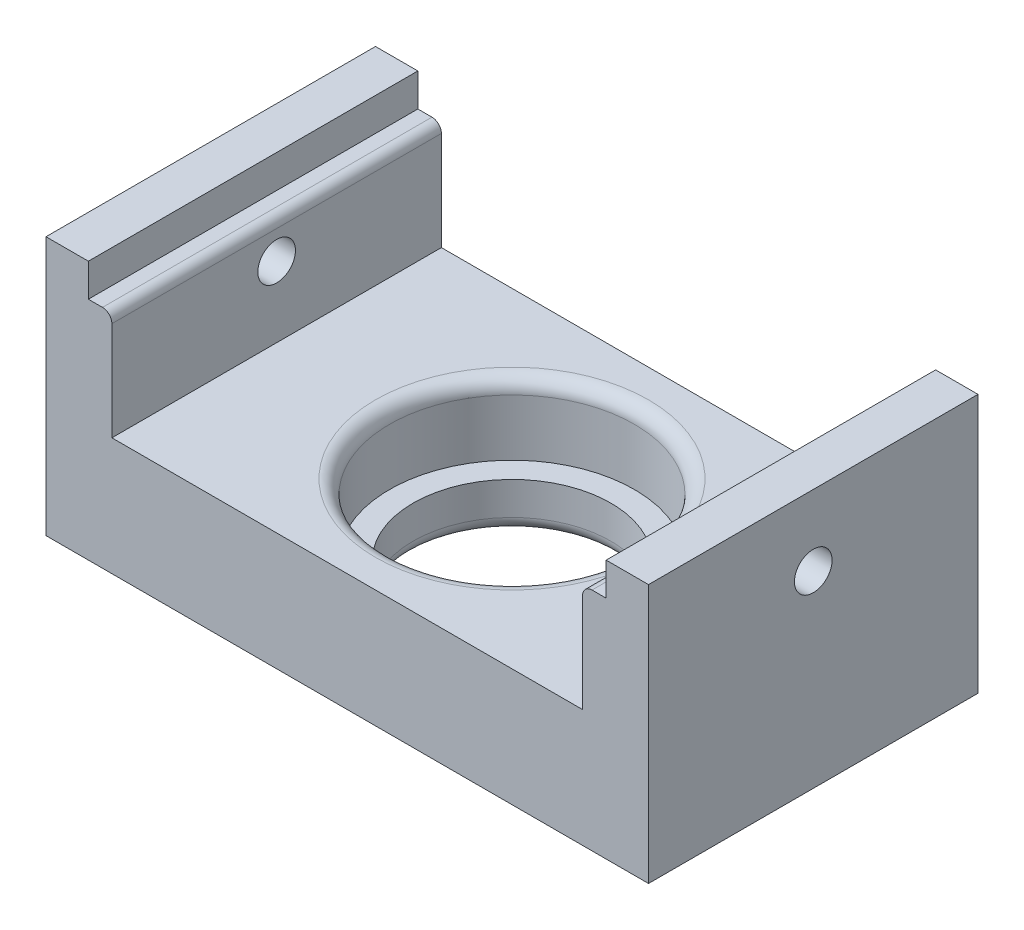
ISO-10303-21;
HEADER;
FILE_DESCRIPTION(('STEP AP214'),'2;1');
FILE_NAME('part.step','',(''),(''),'','','');
FILE_SCHEMA(('AUTOMOTIVE_DESIGN { 1 0 10303 214 1 1 1 1 }'));
ENDSEC;
DATA;
#1=APPLICATION_CONTEXT('core data for automotive mechanical design processes');
#2=APPLICATION_PROTOCOL_DEFINITION('international standard','automotive_design',2000,#1);
#3=PRODUCT_CONTEXT('',#1,'mechanical');
#4=PRODUCT('Part','Part','',(#3));
#5=PRODUCT_RELATED_PRODUCT_CATEGORY('part','',(#4));
#6=PRODUCT_DEFINITION_FORMATION('','',#4);
#7=PRODUCT_DEFINITION_CONTEXT('part definition',#1,'design');
#8=PRODUCT_DEFINITION('design','',#6,#7);
#9=PRODUCT_DEFINITION_SHAPE('','',#8);
#10=(LENGTH_UNIT() NAMED_UNIT(*) SI_UNIT(.MILLI.,.METRE.));
#11=(NAMED_UNIT(*) PLANE_ANGLE_UNIT() SI_UNIT($,.RADIAN.));
#12=(NAMED_UNIT(*) SI_UNIT($,.STERADIAN.) SOLID_ANGLE_UNIT());
#13=UNCERTAINTY_MEASURE_WITH_UNIT(LENGTH_MEASURE(1.E-05),#10,'distance_accuracy_value','');
#14=(GEOMETRIC_REPRESENTATION_CONTEXT(3) GLOBAL_UNCERTAINTY_ASSIGNED_CONTEXT((#13)) GLOBAL_UNIT_ASSIGNED_CONTEXT((#10,
#11,#12)) REPRESENTATION_CONTEXT('',''));
#15=CARTESIAN_POINT('',(0.,0.,0.));
#16=DIRECTION('',(0.,0.,1.));
#17=DIRECTION('',(1.,0.,0.));
#18=AXIS2_PLACEMENT_3D('',#15,#16,#17);
#19=CARTESIAN_POINT('',(25.,13.7500000000225,-3.7499999999823));
#20=DIRECTION('',(1.,0.,0.));
#21=DIRECTION('',(0.,1.28703991908452E-12,-1.));
#22=AXIS2_PLACEMENT_3D('',#19,#20,#21);
#23=PLANE('',#22);
#24=CARTESIAN_POINT('',(25.,6.24999999999997,13.750000000008));
#25=DIRECTION('',(-1.,0.,0.));
#26=DIRECTION('',(0.,-1.28703991908452E-12,1.));
#27=AXIS2_PLACEMENT_3D('',#24,#25,#26);
#28=CIRCLE('',#27,2.);
#29=CARTESIAN_POINT('',(25.,6.2499999999974,15.750000000008));
#30=VERTEX_POINT('',#29);
#31=EDGE_CURVE('E200',#30,#30,#28,.T.);
#32=ORIENTED_EDGE('',*,*,#31,.F.);
#33=EDGE_LOOP('',(#32));
#34=FACE_BOUND('',#33,.T.);
#35=DIRECTION('',(0.,-1.,-1.28703991908452E-12));
#36=VECTOR('',#35,1.);
#37=CARTESIAN_POINT('',(25.,13.7499999999775,31.2500000000177));
#38=LINE('',#37,#36);
#39=CARTESIAN_POINT('',(25.,9.24999999997745,31.2500000000119));
#40=VERTEX_POINT('',#39);
#41=CARTESIAN_POINT('',(25.,-1.25000000002255,31.2499999999984));
#42=VERTEX_POINT('',#41);
#43=EDGE_CURVE('E214',#40,#42,#38,.T.);
#44=ORIENTED_EDGE('',*,*,#43,.F.);
#45=DIRECTION('',(0.,-1.28703991908452E-12,1.));
#46=VECTOR('',#45,1.);
#47=CARTESIAN_POINT('',(25.,9.2500000000225,-3.74999999998809));
#48=LINE('',#47,#46);
#49=CARTESIAN_POINT('',(25.,9.2500000000225,-3.74999999998809));
#50=VERTEX_POINT('',#49);
#51=EDGE_CURVE('E322',#40,#50,#48,.F.);
#52=ORIENTED_EDGE('',*,*,#51,.T.);
#53=DIRECTION('',(0.,-1.,-1.28703991908452E-12));
#54=VECTOR('',#53,1.);
#55=CARTESIAN_POINT('',(25.,13.7500000000225,-3.7499999999823));
#56=LINE('',#55,#54);
#57=CARTESIAN_POINT('',(25.,-1.2499999999775,-3.75000000000161));
#58=VERTEX_POINT('',#57);
#59=EDGE_CURVE('E208',#50,#58,#56,.T.);
#60=ORIENTED_EDGE('',*,*,#59,.T.);
#61=DIRECTION('',(0.,-1.28703991908452E-12,1.));
#62=VECTOR('',#61,1.);
#63=CARTESIAN_POINT('',(25.,-1.2499999999775,-3.75000000000161));
#64=LINE('',#63,#62);
#65=EDGE_CURVE('E218',#58,#42,#64,.T.);
#66=ORIENTED_EDGE('',*,*,#65,.T.);
#67=EDGE_LOOP('',(#44,#52,#60,#66));
#68=FACE_BOUND('',#67,.T.);
#69=ADVANCED_FACE('F42',(#34,#68),#23,.F.);
#70=CARTESIAN_POINT('',(0.,-1.25000000000003,13.7499999999984));
#71=DIRECTION('',(0.,1.,1.28703991908452E-12));
#72=DIRECTION('',(1.,0.,0.));
#73=AXIS2_PLACEMENT_3D('',#70,#71,#72);
#74=PLANE('',#73);
#75=CARTESIAN_POINT('',(0.,-1.25000000000003,13.7499999999984));
#76=DIRECTION('',(0.,1.,1.28703991908452E-12));
#77=DIRECTION('',(1.,0.,0.));
#78=AXIS2_PLACEMENT_3D('',#75,#76,#77);
#79=CIRCLE('',#78,14.5);
#80=CARTESIAN_POINT('',(14.5,-1.25000000000003,13.7499999999984));
#81=VERTEX_POINT('',#80);
#82=EDGE_CURVE('E300',#81,#81,#79,.F.);
#83=ORIENTED_EDGE('',*,*,#82,.T.);
#84=EDGE_LOOP('',(#83));
#85=FACE_BOUND('',#84,.T.);
#86=DIRECTION('',(1.,0.,0.));
#87=VECTOR('',#86,1.);
#88=CARTESIAN_POINT('',(0.,-1.25000000002255,31.2499999999984));
#89=LINE('',#88,#87);
#90=CARTESIAN_POINT('',(-25.,-1.25000000002255,31.2499999999984));
#91=VERTEX_POINT('',#90);
#92=EDGE_CURVE('E261',#91,#42,#89,.T.);
#93=ORIENTED_EDGE('',*,*,#92,.T.);
#94=ORIENTED_EDGE('',*,*,#65,.F.);
#95=DIRECTION('',(1.,0.,0.));
#96=VECTOR('',#95,1.);
#97=CARTESIAN_POINT('',(0.,-1.2499999999775,-3.75000000000161));
#98=LINE('',#97,#96);
#99=CARTESIAN_POINT('',(-25.,-1.2499999999775,-3.75000000000161));
#100=VERTEX_POINT('',#99);
#101=EDGE_CURVE('E257',#100,#58,#98,.T.);
#102=ORIENTED_EDGE('',*,*,#101,.F.);
#103=DIRECTION('',(0.,1.28703991908452E-12,-1.));
#104=VECTOR('',#103,1.);
#105=CARTESIAN_POINT('',(-25.,-1.2499999999775,-3.75000000000161));
#106=LINE('',#105,#104);
#107=EDGE_CURVE('E222',#91,#100,#106,.T.);
#108=ORIENTED_EDGE('',*,*,#107,.F.);
#109=EDGE_LOOP('',(#93,#94,#102,#108));
#110=FACE_BOUND('',#109,.T.);
#111=ADVANCED_FACE('F349',(#85,#110),#74,.T.);
#112=CARTESIAN_POINT('',(0.,-1.25000000000003,13.7499999999984));
#113=DIRECTION('',(0.,-1.,-1.28703991908452E-12));
#114=DIRECTION('',(-1.,0.,0.));
#115=AXIS2_PLACEMENT_3D('',#112,#113,#114);
#116=CYLINDRICAL_SURFACE('',#115,10.5);
#117=CARTESIAN_POINT('',(0.,-12.25,13.7499999999842));
#118=DIRECTION('',(0.,1.,1.28703991908452E-12));
#119=DIRECTION('',(1.,0.,0.));
#120=AXIS2_PLACEMENT_3D('',#117,#118,#119);
#121=CIRCLE('',#120,10.5);
#122=CARTESIAN_POINT('',(10.5,-12.25,13.7499999999842));
#123=VERTEX_POINT('',#122);
#124=EDGE_CURVE('E308',#123,#123,#121,.F.);
#125=ORIENTED_EDGE('',*,*,#124,.T.);
#126=EDGE_LOOP('',(#125));
#127=FACE_BOUND('',#126,.T.);
#128=CARTESIAN_POINT('',(0.,-8.75000000000002,13.7499999999887));
#129=DIRECTION('',(0.,1.,1.28703991908452E-12));
#130=DIRECTION('',(1.,0.,0.));
#131=AXIS2_PLACEMENT_3D('',#128,#129,#130);
#132=CIRCLE('',#131,10.5);
#133=CARTESIAN_POINT('',(10.5,-8.75000000000002,13.7499999999887));
#134=VERTEX_POINT('',#133);
#135=EDGE_CURVE('E256',#134,#134,#132,.T.);
#136=ORIENTED_EDGE('',*,*,#135,.T.);
#137=EDGE_LOOP('',(#136));
#138=FACE_BOUND('',#137,.T.);
#139=ADVANCED_FACE('F396',(#127,#138),#116,.F.);
#140=CARTESIAN_POINT('',(32.,-1.25000000000003,13.7499999999984));
#141=DIRECTION('',(1.,0.,0.));
#142=DIRECTION('',(0.,-1.,-1.28703991908452E-12));
#143=AXIS2_PLACEMENT_3D('',#140,#141,#142);
#144=PLANE('',#143);
#145=CARTESIAN_POINT('',(32.,6.24999999999997,13.750000000008));
#146=DIRECTION('',(-1.,0.,0.));
#147=DIRECTION('',(0.,-1.28703991908452E-12,1.));
#148=AXIS2_PLACEMENT_3D('',#145,#146,#147);
#149=CIRCLE('',#148,2.);
#150=CARTESIAN_POINT('',(32.,6.2499999999974,15.750000000008));
#151=VERTEX_POINT('',#150);
#152=EDGE_CURVE('E204',#151,#151,#149,.T.);
#153=ORIENTED_EDGE('',*,*,#152,.T.);
#154=EDGE_LOOP('',(#153));
#155=FACE_BOUND('',#154,.T.);
#156=DIRECTION('',(0.,-1.28703991908452E-12,1.));
#157=VECTOR('',#156,1.);
#158=CARTESIAN_POINT('',(32.,-13.75,13.7499999999823));
#159=LINE('',#158,#157);
#160=CARTESIAN_POINT('',(32.,-13.7499999999775,-3.75000000001769));
#161=VERTEX_POINT('',#160);
#162=CARTESIAN_POINT('',(32.,-13.7500000000225,31.2499999999823));
#163=VERTEX_POINT('',#162);
#164=EDGE_CURVE('E267',#161,#163,#159,.T.);
#165=ORIENTED_EDGE('',*,*,#164,.F.);
#166=DIRECTION('',(0.,-1.,-1.28703991908452E-12));
#167=VECTOR('',#166,1.);
#168=CARTESIAN_POINT('',(32.,-1.2499999999775,-3.75000000000161));
#169=LINE('',#168,#167);
#170=CARTESIAN_POINT('',(32.,13.7500000000225,-3.7499999999823));
#171=VERTEX_POINT('',#170);
#172=EDGE_CURVE('E290',#171,#161,#169,.T.);
#173=ORIENTED_EDGE('',*,*,#172,.F.);
#174=DIRECTION('',(0.,1.28703991908452E-12,-1.));
#175=VECTOR('',#174,1.);
#176=CARTESIAN_POINT('',(32.,13.7500000000225,-3.7499999999823));
#177=LINE('',#176,#175);
#178=CARTESIAN_POINT('',(32.,13.7499999999775,31.2500000000177));
#179=VERTEX_POINT('',#178);
#180=EDGE_CURVE('E223',#179,#171,#177,.T.);
#181=ORIENTED_EDGE('',*,*,#180,.F.);
#182=DIRECTION('',(0.,-1.,-1.28703991908452E-12));
#183=VECTOR('',#182,1.);
#184=CARTESIAN_POINT('',(32.,-1.25000000002255,31.2499999999984));
#185=LINE('',#184,#183);
#186=EDGE_CURVE('E266',#179,#163,#185,.T.);
#187=ORIENTED_EDGE('',*,*,#186,.T.);
#188=EDGE_LOOP('',(#165,#173,#181,#187));
#189=FACE_BOUND('',#188,.T.);
#190=ADVANCED_FACE('F369',(#155,#189),#144,.T.);
#191=CARTESIAN_POINT('',(0.,-1.2499999999775,-3.75000000000161));
#192=DIRECTION('',(0.,1.28703991908452E-12,-1.));
#193=DIRECTION('',(0.,1.,1.28703991908452E-12));
#194=AXIS2_PLACEMENT_3D('',#191,#192,#193);
#195=PLANE('',#194);
#196=ORIENTED_EDGE('',*,*,#59,.F.);
#197=CARTESIAN_POINT('',(26.,9.2500000000225,-3.74999999998809));
#198=DIRECTION('',(0.,1.28703991908452E-12,-1.));
#199=DIRECTION('',(0.,1.,1.28703991908452E-12));
#200=AXIS2_PLACEMENT_3D('',#197,#198,#199);
#201=CIRCLE('',#200,1.);
#202=CARTESIAN_POINT('',(26.,10.2500000000225,-3.74999999998681));
#203=VERTEX_POINT('',#202);
#204=EDGE_CURVE('E327',#50,#203,#201,.T.);
#205=ORIENTED_EDGE('',*,*,#204,.T.);
#206=DIRECTION('',(-1.,0.,0.));
#207=VECTOR('',#206,1.);
#208=CARTESIAN_POINT('',(25.,10.2500000000225,-3.74999999998681));
#209=LINE('',#208,#207);
#210=CARTESIAN_POINT('',(27.5,10.2500000000225,-3.74999999998681));
#211=VERTEX_POINT('',#210);
#212=EDGE_CURVE('E178',#211,#203,#209,.T.);
#213=ORIENTED_EDGE('',*,*,#212,.F.);
#214=DIRECTION('',(0.,1.,1.28703991908452E-12));
#215=VECTOR('',#214,1.);
#216=CARTESIAN_POINT('',(27.5,10.2500000000225,-3.74999999998681));
#217=LINE('',#216,#215);
#218=CARTESIAN_POINT('',(27.5,13.7500000000225,-3.7499999999823));
#219=VERTEX_POINT('',#218);
#220=EDGE_CURVE('E179',#211,#219,#217,.T.);
#221=ORIENTED_EDGE('',*,*,#220,.T.);
#222=DIRECTION('',(-1.,0.,0.));
#223=VECTOR('',#222,1.);
#224=CARTESIAN_POINT('',(32.,13.7500000000225,-3.7499999999823));
#225=LINE('',#224,#223);
#226=EDGE_CURVE('E226',#171,#219,#225,.T.);
#227=ORIENTED_EDGE('',*,*,#226,.F.);
#228=ORIENTED_EDGE('',*,*,#172,.T.);
#229=DIRECTION('',(1.,0.,0.));
#230=VECTOR('',#229,1.);
#231=CARTESIAN_POINT('',(0.,-13.7499999999775,-3.75000000001769));
#232=LINE('',#231,#230);
#233=CARTESIAN_POINT('',(-32.,-13.7499999999775,-3.75000000001769));
#234=VERTEX_POINT('',#233);
#235=EDGE_CURVE('E271',#234,#161,#232,.T.);
#236=ORIENTED_EDGE('',*,*,#235,.F.);
#237=DIRECTION('',(0.,-1.,-1.28703991908452E-12));
#238=VECTOR('',#237,1.);
#239=CARTESIAN_POINT('',(-32.,-1.2499999999775,-3.75000000000161));
#240=LINE('',#239,#238);
#241=CARTESIAN_POINT('',(-32.,13.7500000000225,-3.7499999999823));
#242=VERTEX_POINT('',#241);
#243=EDGE_CURVE('E287',#242,#234,#240,.T.);
#244=ORIENTED_EDGE('',*,*,#243,.F.);
#245=DIRECTION('',(-1.,0.,0.));
#246=VECTOR('',#245,1.);
#247=CARTESIAN_POINT('',(-32.,13.7500000000225,-3.7499999999823));
#248=LINE('',#247,#246);
#249=CARTESIAN_POINT('',(-27.5,13.7500000000225,-3.7499999999823));
#250=VERTEX_POINT('',#249);
#251=EDGE_CURVE('E165',#250,#242,#248,.T.);
#252=ORIENTED_EDGE('',*,*,#251,.F.);
#253=DIRECTION('',(0.,1.,1.28703991908452E-12));
#254=VECTOR('',#253,1.);
#255=CARTESIAN_POINT('',(-27.5,10.2500000000225,-3.74999999998681));
#256=LINE('',#255,#254);
#257=CARTESIAN_POINT('',(-27.5,10.2500000000225,-3.74999999998681));
#258=VERTEX_POINT('',#257);
#259=EDGE_CURVE('E154',#258,#250,#256,.T.);
#260=ORIENTED_EDGE('',*,*,#259,.F.);
#261=DIRECTION('',(-1.,0.,0.));
#262=VECTOR('',#261,1.);
#263=CARTESIAN_POINT('',(-25.,10.2500000000225,-3.74999999998681));
#264=LINE('',#263,#262);
#265=CARTESIAN_POINT('',(-26.,10.2500000000225,-3.74999999998681));
#266=VERTEX_POINT('',#265);
#267=EDGE_CURVE('E142',#266,#258,#264,.T.);
#268=ORIENTED_EDGE('',*,*,#267,.F.);
#269=CARTESIAN_POINT('',(-26.,9.2500000000225,-3.74999999998809));
#270=DIRECTION('',(0.,1.28703991908452E-12,-1.));
#271=DIRECTION('',(0.,1.,1.28703991908452E-12));
#272=AXIS2_PLACEMENT_3D('',#269,#270,#271);
#273=CIRCLE('',#272,1.);
#274=CARTESIAN_POINT('',(-25.,9.2500000000225,-3.74999999998809));
#275=VERTEX_POINT('',#274);
#276=EDGE_CURVE('E58',#266,#275,#273,.T.);
#277=ORIENTED_EDGE('',*,*,#276,.T.);
#278=DIRECTION('',(0.,-1.,-1.28703991908452E-12));
#279=VECTOR('',#278,1.);
#280=CARTESIAN_POINT('',(-25.,13.7500000000225,-3.7499999999823));
#281=LINE('',#280,#279);
#282=EDGE_CURVE('E243',#275,#100,#281,.T.);
#283=ORIENTED_EDGE('',*,*,#282,.T.);
#284=ORIENTED_EDGE('',*,*,#101,.T.);
#285=EDGE_LOOP('',(#196,#205,#213,#221,#227,#228,#236,#244,#252,#260,#268,#277,#283,#284));
#286=FACE_BOUND('',#285,.T.);
#287=ADVANCED_FACE('F163',(#286),#195,.T.);
#288=CARTESIAN_POINT('',(-32.,-1.25000000000003,13.7499999999984));
#289=DIRECTION('',(1.,0.,0.));
#290=DIRECTION('',(0.,-1.,-1.28703991908452E-12));
#291=AXIS2_PLACEMENT_3D('',#288,#289,#290);
#292=PLANE('',#291);
#293=CARTESIAN_POINT('',(-32.,6.24999999999997,13.7500000000081));
#294=DIRECTION('',(1.,0.,0.));
#295=DIRECTION('',(0.,1.28703991908452E-12,-1.));
#296=AXIS2_PLACEMENT_3D('',#293,#294,#295);
#297=CIRCLE('',#296,2.);
#298=CARTESIAN_POINT('',(-32.,6.25000000000255,11.7500000000081));
#299=VERTEX_POINT('',#298);
#300=EDGE_CURVE('E196',#299,#299,#297,.T.);
#301=ORIENTED_EDGE('',*,*,#300,.T.);
#302=EDGE_LOOP('',(#301));
#303=FACE_BOUND('',#302,.T.);
#304=DIRECTION('',(0.,-1.28703991908452E-12,1.));
#305=VECTOR('',#304,1.);
#306=CARTESIAN_POINT('',(-32.,-13.75,13.7499999999823));
#307=LINE('',#306,#305);
#308=CARTESIAN_POINT('',(-32.,-13.7500000000225,31.2499999999823));
#309=VERTEX_POINT('',#308);
#310=EDGE_CURVE('E275',#234,#309,#307,.T.);
#311=ORIENTED_EDGE('',*,*,#310,.T.);
#312=DIRECTION('',(0.,-1.,-1.28703991908452E-12));
#313=VECTOR('',#312,1.);
#314=CARTESIAN_POINT('',(-32.,-1.25000000002255,31.2499999999984));
#315=LINE('',#314,#313);
#316=CARTESIAN_POINT('',(-32.,13.7499999999775,31.2500000000177));
#317=VERTEX_POINT('',#316);
#318=EDGE_CURVE('E283',#317,#309,#315,.T.);
#319=ORIENTED_EDGE('',*,*,#318,.F.);
#320=DIRECTION('',(0.,-1.28703991908452E-12,1.));
#321=VECTOR('',#320,1.);
#322=CARTESIAN_POINT('',(-32.,13.7500000000225,-3.7499999999823));
#323=LINE('',#322,#321);
#324=EDGE_CURVE('E233',#242,#317,#323,.T.);
#325=ORIENTED_EDGE('',*,*,#324,.F.);
#326=ORIENTED_EDGE('',*,*,#243,.T.);
#327=EDGE_LOOP('',(#311,#319,#325,#326));
#328=FACE_BOUND('',#327,.T.);
#329=ADVANCED_FACE('F360',(#303,#328),#292,.F.);
#330=CARTESIAN_POINT('',(0.,-1.25000000002255,31.2499999999984));
#331=DIRECTION('',(0.,1.28703991908452E-12,-1.));
#332=DIRECTION('',(0.,1.,1.28703991908452E-12));
#333=AXIS2_PLACEMENT_3D('',#330,#331,#332);
#334=PLANE('',#333);
#335=DIRECTION('',(1.,0.,0.));
#336=VECTOR('',#335,1.);
#337=CARTESIAN_POINT('',(25.,10.2499999999775,31.2500000000132));
#338=LINE('',#337,#336);
#339=CARTESIAN_POINT('',(26.,10.2499999999775,31.2500000000132));
#340=VERTEX_POINT('',#339);
#341=CARTESIAN_POINT('',(27.5,10.2499999999775,31.2500000000132));
#342=VERTEX_POINT('',#341);
#343=EDGE_CURVE('E186',#340,#342,#338,.T.);
#344=ORIENTED_EDGE('',*,*,#343,.F.);
#345=CARTESIAN_POINT('',(26.,9.24999999997745,31.2500000000119));
#346=DIRECTION('',(0.,1.28703991908452E-12,-1.));
#347=DIRECTION('',(0.,1.,1.28703991908452E-12));
#348=AXIS2_PLACEMENT_3D('',#345,#346,#347);
#349=CIRCLE('',#348,1.);
#350=EDGE_CURVE('E319',#340,#40,#349,.F.);
#351=ORIENTED_EDGE('',*,*,#350,.T.);
#352=ORIENTED_EDGE('',*,*,#43,.T.);
#353=ORIENTED_EDGE('',*,*,#92,.F.);
#354=DIRECTION('',(0.,-1.,-1.28703991908452E-12));
#355=VECTOR('',#354,1.);
#356=CARTESIAN_POINT('',(-25.,13.7499999999775,31.2500000000177));
#357=LINE('',#356,#355);
#358=CARTESIAN_POINT('',(-25.,9.24999999997745,31.2500000000119));
#359=VERTEX_POINT('',#358);
#360=EDGE_CURVE('E249',#359,#91,#357,.T.);
#361=ORIENTED_EDGE('',*,*,#360,.F.);
#362=CARTESIAN_POINT('',(-26.,9.24999999997745,31.2500000000119));
#363=DIRECTION('',(0.,1.28703991908452E-12,-1.));
#364=DIRECTION('',(0.,1.,1.28703991908452E-12));
#365=AXIS2_PLACEMENT_3D('',#362,#363,#364);
#366=CIRCLE('',#365,1.);
#367=CARTESIAN_POINT('',(-26.,10.2499999999775,31.2500000000132));
#368=VERTEX_POINT('',#367);
#369=EDGE_CURVE('E316',#359,#368,#366,.F.);
#370=ORIENTED_EDGE('',*,*,#369,.T.);
#371=DIRECTION('',(1.,0.,0.));
#372=VECTOR('',#371,1.);
#373=CARTESIAN_POINT('',(-25.,10.2499999999775,31.2500000000132));
#374=LINE('',#373,#372);
#375=CARTESIAN_POINT('',(-27.5,10.2499999999775,31.2500000000132));
#376=VERTEX_POINT('',#375);
#377=EDGE_CURVE('E159',#376,#368,#374,.T.);
#378=ORIENTED_EDGE('',*,*,#377,.F.);
#379=DIRECTION('',(0.,1.,1.28703991908452E-12));
#380=VECTOR('',#379,1.);
#381=CARTESIAN_POINT('',(-27.5,10.2499999999775,31.2500000000132));
#382=LINE('',#381,#380);
#383=CARTESIAN_POINT('',(-27.5,13.7499999999775,31.2500000000177));
#384=VERTEX_POINT('',#383);
#385=EDGE_CURVE('E157',#376,#384,#382,.T.);
#386=ORIENTED_EDGE('',*,*,#385,.T.);
#387=DIRECTION('',(1.,0.,0.));
#388=VECTOR('',#387,1.);
#389=CARTESIAN_POINT('',(-32.,13.7499999999775,31.2500000000177));
#390=LINE('',#389,#388);
#391=EDGE_CURVE('E237',#317,#384,#390,.T.);
#392=ORIENTED_EDGE('',*,*,#391,.F.);
#393=ORIENTED_EDGE('',*,*,#318,.T.);
#394=DIRECTION('',(1.,0.,0.));
#395=VECTOR('',#394,1.);
#396=CARTESIAN_POINT('',(0.,-13.7500000000225,31.2499999999823));
#397=LINE('',#396,#395);
#398=EDGE_CURVE('E262',#309,#163,#397,.T.);
#399=ORIENTED_EDGE('',*,*,#398,.T.);
#400=ORIENTED_EDGE('',*,*,#186,.F.);
#401=DIRECTION('',(1.,0.,0.));
#402=VECTOR('',#401,1.);
#403=CARTESIAN_POINT('',(32.,13.7499999999775,31.2500000000177));
#404=LINE('',#403,#402);
#405=CARTESIAN_POINT('',(27.5,13.7499999999775,31.2500000000177));
#406=VERTEX_POINT('',#405);
#407=EDGE_CURVE('E217',#406,#179,#404,.T.);
#408=ORIENTED_EDGE('',*,*,#407,.F.);
#409=DIRECTION('',(0.,1.,1.28703991908452E-12));
#410=VECTOR('',#409,1.);
#411=CARTESIAN_POINT('',(27.5,10.2499999999775,31.2500000000132));
#412=LINE('',#411,#410);
#413=EDGE_CURVE('E175',#342,#406,#412,.T.);
#414=ORIENTED_EDGE('',*,*,#413,.F.);
#415=EDGE_LOOP('',(#344,#351,#352,#353,#361,#370,#378,#386,#392,#393,#399,#400,#408,#414));
#416=FACE_BOUND('',#415,.T.);
#417=ADVANCED_FACE('F342',(#416),#334,.F.);
#418=CARTESIAN_POINT('',(0.,-13.75,13.7499999999823));
#419=DIRECTION('',(0.,1.,1.28703991908452E-12));
#420=DIRECTION('',(1.,0.,0.));
#421=AXIS2_PLACEMENT_3D('',#418,#419,#420);
#422=PLANE('',#421);
#423=CARTESIAN_POINT('',(0.,-13.75,13.7499999999823));
#424=DIRECTION('',(0.,1.,1.28703991908452E-12));
#425=DIRECTION('',(1.,0.,0.));
#426=AXIS2_PLACEMENT_3D('',#423,#424,#425);
#427=CIRCLE('',#426,12.);
#428=CARTESIAN_POINT('',(12.,-13.75,13.7499999999823));
#429=VERTEX_POINT('',#428);
#430=EDGE_CURVE('E304',#429,#429,#427,.T.);
#431=ORIENTED_EDGE('',*,*,#430,.T.);
#432=EDGE_LOOP('',(#431));
#433=FACE_BOUND('',#432,.T.);
#434=ORIENTED_EDGE('',*,*,#164,.T.);
#435=ORIENTED_EDGE('',*,*,#398,.F.);
#436=ORIENTED_EDGE('',*,*,#310,.F.);
#437=ORIENTED_EDGE('',*,*,#235,.T.);
#438=EDGE_LOOP('',(#434,#435,#436,#437));
#439=FACE_BOUND('',#438,.T.);
#440=ADVANCED_FACE('F365',(#433,#439),#422,.F.);
#441=CARTESIAN_POINT('',(0.,-8.75000000000002,13.7499999999887));
#442=DIRECTION('',(0.,1.,1.28703991908452E-12));
#443=DIRECTION('',(1.,0.,0.));
#444=AXIS2_PLACEMENT_3D('',#441,#442,#443);
#445=CYLINDRICAL_SURFACE('',#444,13.);
#446=CARTESIAN_POINT('',(0.,-2.75000000000002,13.7499999999965));
#447=DIRECTION('',(0.,1.,1.28703991908452E-12));
#448=DIRECTION('',(1.,0.,0.));
#449=AXIS2_PLACEMENT_3D('',#446,#447,#448);
#450=CIRCLE('',#449,13.);
#451=CARTESIAN_POINT('',(13.,-2.75000000000002,13.7499999999965));
#452=VERTEX_POINT('',#451);
#453=EDGE_CURVE('E293',#452,#452,#450,.T.);
#454=ORIENTED_EDGE('',*,*,#453,.T.);
#455=EDGE_LOOP('',(#454));
#456=FACE_BOUND('',#455,.T.);
#457=CARTESIAN_POINT('',(0.,-8.75000000000002,13.7499999999887));
#458=DIRECTION('',(0.,1.,1.28703991908452E-12));
#459=DIRECTION('',(1.,0.,0.));
#460=AXIS2_PLACEMENT_3D('',#457,#458,#459);
#461=CIRCLE('',#460,13.);
#462=CARTESIAN_POINT('',(13.,-8.75000000000002,13.7499999999887));
#463=VERTEX_POINT('',#462);
#464=EDGE_CURVE('E252',#463,#463,#461,.T.);
#465=ORIENTED_EDGE('',*,*,#464,.F.);
#466=EDGE_LOOP('',(#465));
#467=FACE_BOUND('',#466,.T.);
#468=ADVANCED_FACE('F414',(#456,#467),#445,.F.);
#469=CARTESIAN_POINT('',(0.,-8.75000000000002,13.7499999999887));
#470=DIRECTION('',(0.,1.,1.28703991908452E-12));
#471=DIRECTION('',(1.,0.,0.));
#472=AXIS2_PLACEMENT_3D('',#469,#470,#471);
#473=PLANE('',#472);
#474=ORIENTED_EDGE('',*,*,#135,.F.);
#475=EDGE_LOOP('',(#474));
#476=FACE_BOUND('',#475,.T.);
#477=ORIENTED_EDGE('',*,*,#464,.T.);
#478=EDGE_LOOP('',(#477));
#479=FACE_BOUND('',#478,.T.);
#480=ADVANCED_FACE('F410',(#476,#479),#473,.T.);
#481=CARTESIAN_POINT('',(-25.,13.7500000000225,-3.7499999999823));
#482=DIRECTION('',(-1.,0.,0.));
#483=DIRECTION('',(0.,-1.28703991908452E-12,1.));
#484=AXIS2_PLACEMENT_3D('',#481,#482,#483);
#485=PLANE('',#484);
#486=CARTESIAN_POINT('',(-25.,6.24999999999997,13.750000000008));
#487=DIRECTION('',(1.,0.,0.));
#488=DIRECTION('',(0.,1.28703991908452E-12,-1.));
#489=AXIS2_PLACEMENT_3D('',#486,#487,#488);
#490=CIRCLE('',#489,2.);
#491=CARTESIAN_POINT('',(-25.,6.25000000000255,11.750000000008));
#492=VERTEX_POINT('',#491);
#493=EDGE_CURVE('E170',#492,#492,#490,.T.);
#494=ORIENTED_EDGE('',*,*,#493,.F.);
#495=EDGE_LOOP('',(#494));
#496=FACE_BOUND('',#495,.T.);
#497=ORIENTED_EDGE('',*,*,#282,.F.);
#498=DIRECTION('',(0.,1.28703991908452E-12,-1.));
#499=VECTOR('',#498,1.);
#500=CARTESIAN_POINT('',(-25.,9.2500000000225,-3.74999999998809));
#501=LINE('',#500,#499);
#502=EDGE_CURVE('E11',#275,#359,#501,.F.);
#503=ORIENTED_EDGE('',*,*,#502,.T.);
#504=ORIENTED_EDGE('',*,*,#360,.T.);
#505=ORIENTED_EDGE('',*,*,#107,.T.);
#506=EDGE_LOOP('',(#497,#503,#504,#505));
#507=FACE_BOUND('',#506,.T.);
#508=ADVANCED_FACE('F352',(#496,#507),#485,.F.);
#509=CARTESIAN_POINT('',(0.,13.75,13.7500000000177));
#510=DIRECTION('',(0.,1.,1.28703991908452E-12));
#511=DIRECTION('',(1.,0.,0.));
#512=AXIS2_PLACEMENT_3D('',#509,#510,#511);
#513=PLANE('',#512);
#514=DIRECTION('',(0.,-1.28703991908452E-12,1.));
#515=VECTOR('',#514,1.);
#516=CARTESIAN_POINT('',(-27.5,13.7500000000225,-3.7499999999823));
#517=LINE('',#516,#515);
#518=EDGE_CURVE('E150',#250,#384,#517,.T.);
#519=ORIENTED_EDGE('',*,*,#518,.F.);
#520=ORIENTED_EDGE('',*,*,#251,.T.);
#521=ORIENTED_EDGE('',*,*,#324,.T.);
#522=ORIENTED_EDGE('',*,*,#391,.T.);
#523=EDGE_LOOP('',(#519,#520,#521,#522));
#524=FACE_BOUND('',#523,.T.);
#525=ADVANCED_FACE('F357',(#524),#513,.T.);
#526=CARTESIAN_POINT('',(0.,13.75,13.7500000000177));
#527=DIRECTION('',(0.,-1.,-1.28703991908452E-12));
#528=DIRECTION('',(-1.,0.,0.));
#529=AXIS2_PLACEMENT_3D('',#526,#527,#528);
#530=PLANE('',#529);
#531=ORIENTED_EDGE('',*,*,#226,.T.);
#532=DIRECTION('',(0.,1.28703991908452E-12,-1.));
#533=VECTOR('',#532,1.);
#534=CARTESIAN_POINT('',(27.5,13.7500000000225,-3.7499999999823));
#535=LINE('',#534,#533);
#536=EDGE_CURVE('E183',#406,#219,#535,.T.);
#537=ORIENTED_EDGE('',*,*,#536,.F.);
#538=ORIENTED_EDGE('',*,*,#407,.T.);
#539=ORIENTED_EDGE('',*,*,#180,.T.);
#540=EDGE_LOOP('',(#531,#537,#538,#539));
#541=FACE_BOUND('',#540,.T.);
#542=ADVANCED_FACE('F375',(#541),#530,.F.);
#543=CARTESIAN_POINT('',(32.,6.24999999999997,13.750000000008));
#544=DIRECTION('',(-1.,0.,0.));
#545=DIRECTION('',(0.,-1.28703991908452E-12,1.));
#546=AXIS2_PLACEMENT_3D('',#543,#544,#545);
#547=CYLINDRICAL_SURFACE('',#546,2.);
#548=ORIENTED_EDGE('',*,*,#152,.F.);
#549=EDGE_LOOP('',(#548));
#550=FACE_BOUND('',#549,.T.);
#551=ORIENTED_EDGE('',*,*,#31,.T.);
#552=EDGE_LOOP('',(#551));
#553=FACE_BOUND('',#552,.T.);
#554=ADVANCED_FACE('F402',(#550,#553),#547,.F.);
#555=CARTESIAN_POINT('',(-32.,6.24999999999997,13.7500000000081));
#556=DIRECTION('',(1.,0.,0.));
#557=DIRECTION('',(0.,1.28703991908452E-12,-1.));
#558=AXIS2_PLACEMENT_3D('',#555,#556,#557);
#559=CYLINDRICAL_SURFACE('',#558,2.);
#560=ORIENTED_EDGE('',*,*,#300,.F.);
#561=EDGE_LOOP('',(#560));
#562=FACE_BOUND('',#561,.T.);
#563=ORIENTED_EDGE('',*,*,#493,.T.);
#564=EDGE_LOOP('',(#563));
#565=FACE_BOUND('',#564,.T.);
#566=ADVANCED_FACE('F436',(#562,#565),#559,.F.);
#567=CARTESIAN_POINT('',(0.,-2.75000000000002,13.7499999999965));
#568=DIRECTION('',(0.,1.,1.28703991908452E-12));
#569=DIRECTION('',(1.,0.,0.));
#570=AXIS2_PLACEMENT_3D('',#567,#568,#569);
#571=TOROIDAL_SURFACE('',#570,14.5,1.5);
#572=ORIENTED_EDGE('',*,*,#82,.F.);
#573=EDGE_LOOP('',(#572));
#574=FACE_BOUND('',#573,.T.);
#575=ORIENTED_EDGE('',*,*,#453,.F.);
#576=EDGE_LOOP('',(#575));
#577=FACE_BOUND('',#576,.T.);
#578=ADVANCED_FACE('F386',(#574,#577),#571,.T.);
#579=CARTESIAN_POINT('',(0.,-12.25,13.7499999999842));
#580=DIRECTION('',(0.,1.,1.28703991908452E-12));
#581=DIRECTION('',(1.,0.,0.));
#582=AXIS2_PLACEMENT_3D('',#579,#580,#581);
#583=TOROIDAL_SURFACE('',#582,12.,1.5);
#584=ORIENTED_EDGE('',*,*,#124,.F.);
#585=EDGE_LOOP('',(#584));
#586=FACE_BOUND('',#585,.T.);
#587=ORIENTED_EDGE('',*,*,#430,.F.);
#588=EDGE_LOOP('',(#587));
#589=FACE_BOUND('',#588,.T.);
#590=ADVANCED_FACE('F379',(#586,#589),#583,.T.);
#591=CARTESIAN_POINT('',(27.5,10.2500000000225,-3.74999999998681));
#592=DIRECTION('',(1.,0.,0.));
#593=DIRECTION('',(0.,1.28703991908452E-12,-1.));
#594=AXIS2_PLACEMENT_3D('',#591,#592,#593);
#595=PLANE('',#594);
#596=ORIENTED_EDGE('',*,*,#536,.T.);
#597=ORIENTED_EDGE('',*,*,#220,.F.);
#598=DIRECTION('',(0.,1.28703991908452E-12,-1.));
#599=VECTOR('',#598,1.);
#600=CARTESIAN_POINT('',(27.5,10.2500000000225,-3.74999999998681));
#601=LINE('',#600,#599);
#602=EDGE_CURVE('E190',#342,#211,#601,.T.);
#603=ORIENTED_EDGE('',*,*,#602,.F.);
#604=ORIENTED_EDGE('',*,*,#413,.T.);
#605=EDGE_LOOP('',(#596,#597,#603,#604));
#606=FACE_BOUND('',#605,.T.);
#607=ADVANCED_FACE('F377',(#606),#595,.F.);
#608=CARTESIAN_POINT('',(0.,10.25,13.7500000000132));
#609=DIRECTION('',(0.,1.,1.28703991908452E-12));
#610=DIRECTION('',(1.,0.,0.));
#611=AXIS2_PLACEMENT_3D('',#608,#609,#610);
#612=PLANE('',#611);
#613=ORIENTED_EDGE('',*,*,#212,.T.);
#614=DIRECTION('',(0.,-1.28703991908452E-12,1.));
#615=VECTOR('',#614,1.);
#616=CARTESIAN_POINT('',(26.,10.2499999999775,31.2500000000132));
#617=LINE('',#616,#615);
#618=EDGE_CURVE('E312',#203,#340,#617,.T.);
#619=ORIENTED_EDGE('',*,*,#618,.T.);
#620=ORIENTED_EDGE('',*,*,#343,.T.);
#621=ORIENTED_EDGE('',*,*,#602,.T.);
#622=EDGE_LOOP('',(#613,#619,#620,#621));
#623=FACE_BOUND('',#622,.T.);
#624=ADVANCED_FACE('F336',(#623),#612,.T.);
#625=CARTESIAN_POINT('',(-27.5,10.2500000000225,-3.74999999998681));
#626=DIRECTION('',(-1.,0.,0.));
#627=DIRECTION('',(0.,-1.28703991908452E-12,1.));
#628=AXIS2_PLACEMENT_3D('',#625,#626,#627);
#629=PLANE('',#628);
#630=ORIENTED_EDGE('',*,*,#518,.T.);
#631=ORIENTED_EDGE('',*,*,#385,.F.);
#632=DIRECTION('',(0.,-1.28703991908452E-12,1.));
#633=VECTOR('',#632,1.);
#634=CARTESIAN_POINT('',(-27.5,10.2500000000225,-3.74999999998681));
#635=LINE('',#634,#633);
#636=EDGE_CURVE('E146',#258,#376,#635,.T.);
#637=ORIENTED_EDGE('',*,*,#636,.F.);
#638=ORIENTED_EDGE('',*,*,#259,.T.);
#639=EDGE_LOOP('',(#630,#631,#637,#638));
#640=FACE_BOUND('',#639,.T.);
#641=ADVANCED_FACE('F153',(#640),#629,.F.);
#642=CARTESIAN_POINT('',(0.,10.25,13.7500000000132));
#643=DIRECTION('',(0.,-1.,-1.28703991908452E-12));
#644=DIRECTION('',(-1.,0.,0.));
#645=AXIS2_PLACEMENT_3D('',#642,#643,#644);
#646=PLANE('',#645);
#647=ORIENTED_EDGE('',*,*,#377,.T.);
#648=DIRECTION('',(0.,1.28703991908452E-12,-1.));
#649=VECTOR('',#648,1.);
#650=CARTESIAN_POINT('',(-26.,10.25,13.7500000000132));
#651=LINE('',#650,#649);
#652=EDGE_CURVE('E51',#368,#266,#651,.T.);
#653=ORIENTED_EDGE('',*,*,#652,.T.);
#654=ORIENTED_EDGE('',*,*,#267,.T.);
#655=ORIENTED_EDGE('',*,*,#636,.T.);
#656=EDGE_LOOP('',(#647,#653,#654,#655));
#657=FACE_BOUND('',#656,.T.);
#658=ADVANCED_FACE('F145',(#657),#646,.F.);
#659=CARTESIAN_POINT('',(26.,9.24999999999997,13.7500000000119));
#660=DIRECTION('',(0.,1.28703991908452E-12,-1.));
#661=DIRECTION('',(-1.,0.,0.));
#662=AXIS2_PLACEMENT_3D('',#659,#660,#661);
#663=CYLINDRICAL_SURFACE('',#662,1.);
#664=ORIENTED_EDGE('',*,*,#204,.F.);
#665=ORIENTED_EDGE('',*,*,#51,.F.);
#666=ORIENTED_EDGE('',*,*,#350,.F.);
#667=ORIENTED_EDGE('',*,*,#618,.F.);
#668=EDGE_LOOP('',(#664,#665,#666,#667));
#669=FACE_BOUND('',#668,.T.);
#670=ADVANCED_FACE('F339',(#669),#663,.T.);
#671=CARTESIAN_POINT('',(-26.,9.24999999999997,13.7500000000119));
#672=DIRECTION('',(0.,1.28703991908452E-12,-1.));
#673=DIRECTION('',(-1.,0.,0.));
#674=AXIS2_PLACEMENT_3D('',#671,#672,#673);
#675=CYLINDRICAL_SURFACE('',#674,1.);
#676=ORIENTED_EDGE('',*,*,#369,.F.);
#677=ORIENTED_EDGE('',*,*,#502,.F.);
#678=ORIENTED_EDGE('',*,*,#276,.F.);
#679=ORIENTED_EDGE('',*,*,#652,.F.);
#680=EDGE_LOOP('',(#676,#677,#678,#679));
#681=FACE_BOUND('',#680,.T.);
#682=ADVANCED_FACE('F44',(#681),#675,.T.);
#683=CLOSED_SHELL('',(#69,#111,#139,#190,#287,#329,#417,#440,#468,#480,#508,#525,#542,#554,#566,
#578,#590,#607,#624,#641,#658,#670,#682));
#684=MANIFOLD_SOLID_BREP('B2',#683);
#685=ADVANCED_BREP_SHAPE_REPRESENTATION('',(#18,#684),#14);
#686=SHAPE_DEFINITION_REPRESENTATION(#9,#685);
ENDSEC;
END-ISO-10303-21;
